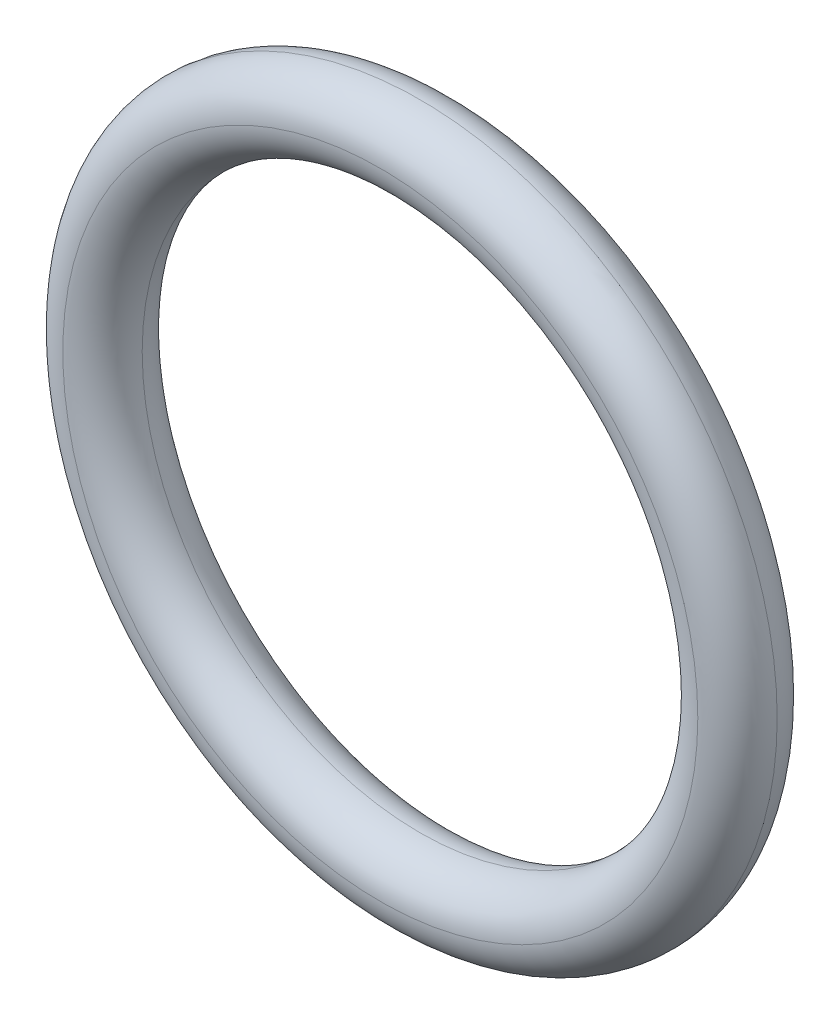
ISO-10303-21;
HEADER;
FILE_DESCRIPTION(('STEP AP214'),'2;1');
FILE_NAME('part.step','',(''),(''),'','','');
FILE_SCHEMA(('AUTOMOTIVE_DESIGN { 1 0 10303 214 1 1 1 1 }'));
ENDSEC;
DATA;
#1=APPLICATION_CONTEXT('core data for automotive mechanical design processes');
#2=APPLICATION_PROTOCOL_DEFINITION('international standard','automotive_design',2000,#1);
#3=PRODUCT_CONTEXT('',#1,'mechanical');
#4=PRODUCT('Part','Part','',(#3));
#5=PRODUCT_RELATED_PRODUCT_CATEGORY('part','',(#4));
#6=PRODUCT_DEFINITION_FORMATION('','',#4);
#7=PRODUCT_DEFINITION_CONTEXT('part definition',#1,'design');
#8=PRODUCT_DEFINITION('design','',#6,#7);
#9=PRODUCT_DEFINITION_SHAPE('','',#8);
#10=(LENGTH_UNIT() NAMED_UNIT(*) SI_UNIT(.MILLI.,.METRE.));
#11=(NAMED_UNIT(*) PLANE_ANGLE_UNIT() SI_UNIT($,.RADIAN.));
#12=(NAMED_UNIT(*) SI_UNIT($,.STERADIAN.) SOLID_ANGLE_UNIT());
#13=UNCERTAINTY_MEASURE_WITH_UNIT(LENGTH_MEASURE(1.E-05),#10,'distance_accuracy_value','');
#14=(GEOMETRIC_REPRESENTATION_CONTEXT(3) GLOBAL_UNCERTAINTY_ASSIGNED_CONTEXT((#13)) GLOBAL_UNIT_ASSIGNED_CONTEXT((#10,
#11,#12)) REPRESENTATION_CONTEXT('',''));
#15=CARTESIAN_POINT('',(0.,0.,0.));
#16=DIRECTION('',(0.,0.,1.));
#17=DIRECTION('',(1.,0.,0.));
#18=AXIS2_PLACEMENT_3D('',#15,#16,#17);
#19=CARTESIAN_POINT('',(0.,0.,1.));
#20=DIRECTION('',(0.,0.,1.));
#21=DIRECTION('',(1.,0.,0.));
#22=AXIS2_PLACEMENT_3D('',#19,#20,#21);
#23=TOROIDAL_SURFACE('',#22,8.,1.);
#24=CARTESIAN_POINT('',(0.,0.,0.));
#25=DIRECTION('',(0.,0.,1.));
#26=DIRECTION('',(1.,0.,0.));
#27=AXIS2_PLACEMENT_3D('',#24,#25,#26);
#28=CIRCLE('',#27,8.);
#29=CARTESIAN_POINT('',(8.00000000000001,0.,0.));
#30=VERTEX_POINT('',#29);
#31=EDGE_CURVE('E40',#30,#30,#28,.F.);
#32=ORIENTED_EDGE('',*,*,#31,.F.);
#33=EDGE_LOOP('',(#32));
#34=FACE_BOUND('',#33,.T.);
#35=CARTESIAN_POINT('',(0.,0.,1.));
#36=DIRECTION('',(0.,0.,1.));
#37=DIRECTION('',(1.,0.,0.));
#38=AXIS2_PLACEMENT_3D('',#35,#36,#37);
#39=CIRCLE('',#38,9.);
#40=CARTESIAN_POINT('',(9.00000000000001,0.,1.));
#41=VERTEX_POINT('',#40);
#42=EDGE_CURVE('E10',#41,#41,#39,.T.);
#43=ORIENTED_EDGE('',*,*,#42,.F.);
#44=EDGE_LOOP('',(#43));
#45=FACE_BOUND('',#44,.T.);
#46=ADVANCED_FACE('F34',(#34,#45),#23,.T.);
#47=CARTESIAN_POINT('',(0.,0.,1.));
#48=DIRECTION('',(0.,0.,1.));
#49=DIRECTION('',(1.,0.,0.));
#50=AXIS2_PLACEMENT_3D('',#47,#48,#49);
#51=TOROIDAL_SURFACE('',#50,8.,1.);
#52=ORIENTED_EDGE('',*,*,#42,.T.);
#53=EDGE_LOOP('',(#52));
#54=FACE_BOUND('',#53,.T.);
#55=CARTESIAN_POINT('',(0.,0.,2.));
#56=DIRECTION('',(0.,0.,1.));
#57=DIRECTION('',(1.,0.,0.));
#58=AXIS2_PLACEMENT_3D('',#55,#56,#57);
#59=CIRCLE('',#58,8.);
#60=CARTESIAN_POINT('',(8.00000000000001,0.,2.));
#61=VERTEX_POINT('',#60);
#62=EDGE_CURVE('E44',#61,#61,#59,.T.);
#63=ORIENTED_EDGE('',*,*,#62,.F.);
#64=EDGE_LOOP('',(#63));
#65=FACE_BOUND('',#64,.T.);
#66=ADVANCED_FACE('F58',(#54,#65),#51,.T.);
#67=CARTESIAN_POINT('',(0.,0.,1.));
#68=DIRECTION('',(0.,0.,1.));
#69=DIRECTION('',(1.,0.,0.));
#70=AXIS2_PLACEMENT_3D('',#67,#68,#69);
#71=TOROIDAL_SURFACE('',#70,8.,1.);
#72=ORIENTED_EDGE('',*,*,#31,.T.);
#73=EDGE_LOOP('',(#72));
#74=FACE_BOUND('',#73,.T.);
#75=CARTESIAN_POINT('',(0.,0.,1.));
#76=DIRECTION('',(0.,0.,1.));
#77=DIRECTION('',(1.,0.,0.));
#78=AXIS2_PLACEMENT_3D('',#75,#76,#77);
#79=CIRCLE('',#78,7.);
#80=CARTESIAN_POINT('',(7.00000000000001,0.,1.));
#81=VERTEX_POINT('',#80);
#82=EDGE_CURVE('E48',#81,#81,#79,.F.);
#83=ORIENTED_EDGE('',*,*,#82,.F.);
#84=EDGE_LOOP('',(#83));
#85=FACE_BOUND('',#84,.T.);
#86=ADVANCED_FACE('F56',(#74,#85),#71,.T.);
#87=CARTESIAN_POINT('',(0.,0.,1.));
#88=DIRECTION('',(0.,0.,1.));
#89=DIRECTION('',(1.,0.,0.));
#90=AXIS2_PLACEMENT_3D('',#87,#88,#89);
#91=TOROIDAL_SURFACE('',#90,8.,1.);
#92=ORIENTED_EDGE('',*,*,#62,.T.);
#93=EDGE_LOOP('',(#92));
#94=FACE_BOUND('',#93,.T.);
#95=ORIENTED_EDGE('',*,*,#82,.T.);
#96=EDGE_LOOP('',(#95));
#97=FACE_BOUND('',#96,.T.);
#98=ADVANCED_FACE('F54',(#94,#97),#91,.T.);
#99=CLOSED_SHELL('',(#46,#66,#86,#98));
#100=MANIFOLD_SOLID_BREP('B2',#99);
#101=ADVANCED_BREP_SHAPE_REPRESENTATION('',(#18,#100),#14);
#102=SHAPE_DEFINITION_REPRESENTATION(#9,#101);
ENDSEC;
END-ISO-10303-21;
